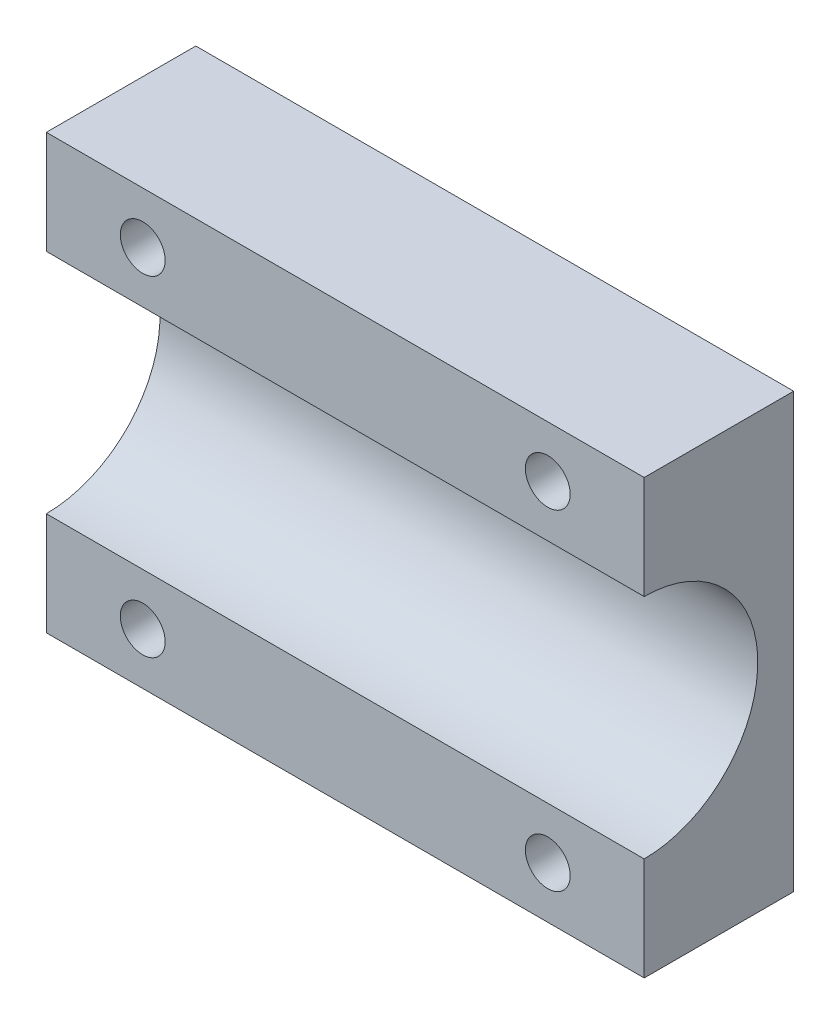
ISO-10303-21;
HEADER;
FILE_DESCRIPTION(('STEP AP214'),'2;1');
FILE_NAME('part.step','',(''),(''),'','','');
FILE_SCHEMA(('AUTOMOTIVE_DESIGN { 1 0 10303 214 1 1 1 1 }'));
ENDSEC;
DATA;
#1=APPLICATION_CONTEXT('core data for automotive mechanical design processes');
#2=APPLICATION_PROTOCOL_DEFINITION('international standard','automotive_design',2000,#1);
#3=PRODUCT_CONTEXT('',#1,'mechanical');
#4=PRODUCT('Part','Part','',(#3));
#5=PRODUCT_RELATED_PRODUCT_CATEGORY('part','',(#4));
#6=PRODUCT_DEFINITION_FORMATION('','',#4);
#7=PRODUCT_DEFINITION_CONTEXT('part definition',#1,'design');
#8=PRODUCT_DEFINITION('design','',#6,#7);
#9=PRODUCT_DEFINITION_SHAPE('','',#8);
#10=(LENGTH_UNIT() NAMED_UNIT(*) SI_UNIT(.MILLI.,.METRE.));
#11=(NAMED_UNIT(*) PLANE_ANGLE_UNIT() SI_UNIT($,.RADIAN.));
#12=(NAMED_UNIT(*) SI_UNIT($,.STERADIAN.) SOLID_ANGLE_UNIT());
#13=UNCERTAINTY_MEASURE_WITH_UNIT(LENGTH_MEASURE(1.E-05),#10,'distance_accuracy_value','');
#14=(GEOMETRIC_REPRESENTATION_CONTEXT(3) GLOBAL_UNCERTAINTY_ASSIGNED_CONTEXT((#13)) GLOBAL_UNIT_ASSIGNED_CONTEXT((#10,
#11,#12)) REPRESENTATION_CONTEXT('',''));
#15=CARTESIAN_POINT('',(0.,0.,0.));
#16=DIRECTION('',(0.,0.,1.));
#17=DIRECTION('',(1.,0.,0.));
#18=AXIS2_PLACEMENT_3D('',#15,#16,#17);
#19=CARTESIAN_POINT('',(0.,0.,10.));
#20=DIRECTION('',(0.,0.,1.));
#21=DIRECTION('',(1.,0.,0.));
#22=AXIS2_PLACEMENT_3D('',#19,#20,#21);
#23=PLANE('',#22);
#24=CARTESIAN_POINT('',(33.55,3.45000000000001,10.));
#25=DIRECTION('',(0.,0.,1.));
#26=DIRECTION('',(1.,0.,0.));
#27=AXIS2_PLACEMENT_3D('',#24,#25,#26);
#28=CIRCLE('',#27,1.5);
#29=CARTESIAN_POINT('',(35.05,3.45000000000001,10.));
#30=VERTEX_POINT('',#29);
#31=EDGE_CURVE('E156',#30,#30,#28,.T.);
#32=ORIENTED_EDGE('',*,*,#31,.F.);
#33=EDGE_LOOP('',(#32));
#34=FACE_BOUND('',#33,.T.);
#35=CARTESIAN_POINT('',(6.45,3.45,10.));
#36=DIRECTION('',(0.,0.,1.));
#37=DIRECTION('',(1.,0.,0.));
#38=AXIS2_PLACEMENT_3D('',#35,#36,#37);
#39=CIRCLE('',#38,1.5);
#40=CARTESIAN_POINT('',(7.95,3.45,10.));
#41=VERTEX_POINT('',#40);
#42=EDGE_CURVE('E164',#41,#41,#39,.T.);
#43=ORIENTED_EDGE('',*,*,#42,.F.);
#44=EDGE_LOOP('',(#43));
#45=FACE_BOUND('',#44,.T.);
#46=DIRECTION('',(1.,0.,0.));
#47=VECTOR('',#46,1.);
#48=CARTESIAN_POINT('',(-21.496046148071,6.9,10.));
#49=LINE('',#48,#47);
#50=CARTESIAN_POINT('',(0.,6.9,10.));
#51=VERTEX_POINT('',#50);
#52=CARTESIAN_POINT('',(40.,6.9,10.));
#53=VERTEX_POINT('',#52);
#54=EDGE_CURVE('E11',#51,#53,#49,.T.);
#55=ORIENTED_EDGE('',*,*,#54,.F.);
#56=DIRECTION('',(0.,1.,0.));
#57=VECTOR('',#56,1.);
#58=CARTESIAN_POINT('',(0.,0.,10.));
#59=LINE('',#58,#57);
#60=CARTESIAN_POINT('',(0.,0.,10.));
#61=VERTEX_POINT('',#60);
#62=EDGE_CURVE('E146',#61,#51,#59,.T.);
#63=ORIENTED_EDGE('',*,*,#62,.F.);
#64=DIRECTION('',(1.,0.,0.));
#65=VECTOR('',#64,1.);
#66=CARTESIAN_POINT('',(0.,0.,10.));
#67=LINE('',#66,#65);
#68=CARTESIAN_POINT('',(40.,0.,10.));
#69=VERTEX_POINT('',#68);
#70=EDGE_CURVE('E122',#61,#69,#67,.T.);
#71=ORIENTED_EDGE('',*,*,#70,.T.);
#72=DIRECTION('',(0.,1.,0.));
#73=VECTOR('',#72,1.);
#74=CARTESIAN_POINT('',(40.,0.,10.));
#75=LINE('',#74,#73);
#76=EDGE_CURVE('E118',#69,#53,#75,.T.);
#77=ORIENTED_EDGE('',*,*,#76,.T.);
#78=EDGE_LOOP('',(#55,#63,#71,#77));
#79=FACE_BOUND('',#78,.T.);
#80=ADVANCED_FACE('F47',(#34,#45,#79),#23,.T.);
#81=CARTESIAN_POINT('',(0.,29.,10.));
#82=DIRECTION('',(0.,1.,0.));
#83=DIRECTION('',(-1.,0.,0.));
#84=AXIS2_PLACEMENT_3D('',#81,#82,#83);
#85=PLANE('',#84);
#86=DIRECTION('',(1.,0.,0.));
#87=VECTOR('',#86,1.);
#88=CARTESIAN_POINT('',(0.,29.,0.));
#89=LINE('',#88,#87);
#90=CARTESIAN_POINT('',(0.,29.,0.));
#91=VERTEX_POINT('',#90);
#92=CARTESIAN_POINT('',(40.,29.,0.));
#93=VERTEX_POINT('',#92);
#94=EDGE_CURVE('E130',#91,#93,#89,.T.);
#95=ORIENTED_EDGE('',*,*,#94,.F.);
#96=DIRECTION('',(0.,0.,-1.));
#97=VECTOR('',#96,1.);
#98=CARTESIAN_POINT('',(0.,29.,10.));
#99=LINE('',#98,#97);
#100=CARTESIAN_POINT('',(0.,29.,10.));
#101=VERTEX_POINT('',#100);
#102=EDGE_CURVE('E144',#101,#91,#99,.T.);
#103=ORIENTED_EDGE('',*,*,#102,.F.);
#104=DIRECTION('',(1.,0.,0.));
#105=VECTOR('',#104,1.);
#106=CARTESIAN_POINT('',(0.,29.,10.));
#107=LINE('',#106,#105);
#108=CARTESIAN_POINT('',(40.,29.,10.));
#109=VERTEX_POINT('',#108);
#110=EDGE_CURVE('E139',#101,#109,#107,.T.);
#111=ORIENTED_EDGE('',*,*,#110,.T.);
#112=DIRECTION('',(0.,0.,-1.));
#113=VECTOR('',#112,1.);
#114=CARTESIAN_POINT('',(40.,29.,10.));
#115=LINE('',#114,#113);
#116=EDGE_CURVE('E91',#109,#93,#115,.T.);
#117=ORIENTED_EDGE('',*,*,#116,.T.);
#118=EDGE_LOOP('',(#95,#103,#111,#117));
#119=FACE_BOUND('',#118,.T.);
#120=ADVANCED_FACE('F49',(#119),#85,.T.);
#121=CARTESIAN_POINT('',(0.,0.,10.));
#122=DIRECTION('',(-1.,0.,0.));
#123=DIRECTION('',(0.,0.,1.));
#124=AXIS2_PLACEMENT_3D('',#121,#122,#123);
#125=PLANE('',#124);
#126=CARTESIAN_POINT('',(0.,14.5,10.));
#127=DIRECTION('',(-1.,0.,0.));
#128=DIRECTION('',(0.,0.,1.));
#129=AXIS2_PLACEMENT_3D('',#126,#127,#128);
#130=CIRCLE('',#129,7.6);
#131=CARTESIAN_POINT('',(0.,22.1,10.));
#132=VERTEX_POINT('',#131);
#133=EDGE_CURVE('E109',#51,#132,#130,.F.);
#134=ORIENTED_EDGE('',*,*,#133,.T.);
#135=EDGE_CURVE('E98',#132,#101,#59,.T.);
#136=ORIENTED_EDGE('',*,*,#135,.T.);
#137=ORIENTED_EDGE('',*,*,#102,.T.);
#138=DIRECTION('',(0.,1.,0.));
#139=VECTOR('',#138,1.);
#140=CARTESIAN_POINT('',(0.,0.,0.));
#141=LINE('',#140,#139);
#142=CARTESIAN_POINT('',(0.,0.,0.));
#143=VERTEX_POINT('',#142);
#144=EDGE_CURVE('E133',#143,#91,#141,.T.);
#145=ORIENTED_EDGE('',*,*,#144,.F.);
#146=DIRECTION('',(0.,0.,-1.));
#147=VECTOR('',#146,1.);
#148=CARTESIAN_POINT('',(0.,0.,10.));
#149=LINE('',#148,#147);
#150=EDGE_CURVE('E142',#61,#143,#149,.T.);
#151=ORIENTED_EDGE('',*,*,#150,.F.);
#152=ORIENTED_EDGE('',*,*,#62,.T.);
#153=EDGE_LOOP('',(#134,#136,#137,#145,#151,#152));
#154=FACE_BOUND('',#153,.T.);
#155=ADVANCED_FACE('F145',(#154),#125,.T.);
#156=CARTESIAN_POINT('',(0.,0.,10.));
#157=DIRECTION('',(0.,1.,0.));
#158=DIRECTION('',(-1.,0.,0.));
#159=AXIS2_PLACEMENT_3D('',#156,#157,#158);
#160=PLANE('',#159);
#161=DIRECTION('',(1.,0.,0.));
#162=VECTOR('',#161,1.);
#163=CARTESIAN_POINT('',(0.,0.,0.));
#164=LINE('',#163,#162);
#165=CARTESIAN_POINT('',(40.,0.,0.));
#166=VERTEX_POINT('',#165);
#167=EDGE_CURVE('E136',#143,#166,#164,.T.);
#168=ORIENTED_EDGE('',*,*,#167,.T.);
#169=DIRECTION('',(0.,0.,-1.));
#170=VECTOR('',#169,1.);
#171=CARTESIAN_POINT('',(40.,0.,10.));
#172=LINE('',#171,#170);
#173=EDGE_CURVE('E125',#69,#166,#172,.T.);
#174=ORIENTED_EDGE('',*,*,#173,.F.);
#175=ORIENTED_EDGE('',*,*,#70,.F.);
#176=ORIENTED_EDGE('',*,*,#150,.T.);
#177=EDGE_LOOP('',(#168,#174,#175,#176));
#178=FACE_BOUND('',#177,.T.);
#179=ADVANCED_FACE('F189',(#178),#160,.F.);
#180=CARTESIAN_POINT('',(40.,0.,10.));
#181=DIRECTION('',(-1.,0.,0.));
#182=DIRECTION('',(0.,0.,1.));
#183=AXIS2_PLACEMENT_3D('',#180,#181,#182);
#184=PLANE('',#183);
#185=CARTESIAN_POINT('',(40.,22.1,10.));
#186=VERTEX_POINT('',#185);
#187=EDGE_CURVE('E69',#186,#109,#75,.T.);
#188=ORIENTED_EDGE('',*,*,#187,.F.);
#189=CARTESIAN_POINT('',(40.,14.5,10.));
#190=DIRECTION('',(1.,0.,0.));
#191=DIRECTION('',(0.,0.,-1.));
#192=AXIS2_PLACEMENT_3D('',#189,#190,#191);
#193=CIRCLE('',#192,7.6);
#194=EDGE_CURVE('E61',#53,#186,#193,.T.);
#195=ORIENTED_EDGE('',*,*,#194,.F.);
#196=ORIENTED_EDGE('',*,*,#76,.F.);
#197=ORIENTED_EDGE('',*,*,#173,.T.);
#198=DIRECTION('',(0.,1.,0.));
#199=VECTOR('',#198,1.);
#200=CARTESIAN_POINT('',(40.,0.,0.));
#201=LINE('',#200,#199);
#202=EDGE_CURVE('E138',#166,#93,#201,.T.);
#203=ORIENTED_EDGE('',*,*,#202,.T.);
#204=ORIENTED_EDGE('',*,*,#116,.F.);
#205=EDGE_LOOP('',(#188,#195,#196,#197,#203,#204));
#206=FACE_BOUND('',#205,.T.);
#207=ADVANCED_FACE('F116',(#206),#184,.F.);
#208=CARTESIAN_POINT('',(6.45,25.55,10.));
#209=DIRECTION('',(0.,0.,1.));
#210=DIRECTION('',(1.,0.,0.));
#211=AXIS2_PLACEMENT_3D('',#208,#209,#210);
#212=CIRCLE('',#211,1.5);
#213=CARTESIAN_POINT('',(7.95,25.55,10.));
#214=VERTEX_POINT('',#213);
#215=EDGE_CURVE('E157',#214,#214,#212,.T.);
#216=ORIENTED_EDGE('',*,*,#215,.F.);
#217=EDGE_LOOP('',(#216));
#218=FACE_BOUND('',#217,.T.);
#219=CARTESIAN_POINT('',(33.55,25.55,10.));
#220=DIRECTION('',(0.,0.,1.));
#221=DIRECTION('',(1.,0.,0.));
#222=AXIS2_PLACEMENT_3D('',#219,#220,#221);
#223=CIRCLE('',#222,1.5);
#224=CARTESIAN_POINT('',(35.05,25.55,10.));
#225=VERTEX_POINT('',#224);
#226=EDGE_CURVE('E153',#225,#225,#223,.T.);
#227=ORIENTED_EDGE('',*,*,#226,.F.);
#228=EDGE_LOOP('',(#227));
#229=FACE_BOUND('',#228,.T.);
#230=DIRECTION('',(1.,0.,0.));
#231=VECTOR('',#230,1.);
#232=CARTESIAN_POINT('',(-21.496046148071,22.1,10.));
#233=LINE('',#232,#231);
#234=EDGE_CURVE('E55',#186,#132,#233,.F.);
#235=ORIENTED_EDGE('',*,*,#234,.F.);
#236=ORIENTED_EDGE('',*,*,#187,.T.);
#237=ORIENTED_EDGE('',*,*,#110,.F.);
#238=ORIENTED_EDGE('',*,*,#135,.F.);
#239=EDGE_LOOP('',(#235,#236,#237,#238));
#240=FACE_BOUND('',#239,.T.);
#241=ADVANCED_FACE('F148',(#218,#229,#240),#23,.T.);
#242=CARTESIAN_POINT('',(0.,0.,0.));
#243=DIRECTION('',(0.,0.,1.));
#244=DIRECTION('',(1.,0.,0.));
#245=AXIS2_PLACEMENT_3D('',#242,#243,#244);
#246=PLANE('',#245);
#247=CARTESIAN_POINT('',(33.55,3.45000000000001,0.));
#248=DIRECTION('',(0.,0.,1.));
#249=DIRECTION('',(1.,0.,0.));
#250=AXIS2_PLACEMENT_3D('',#247,#248,#249);
#251=CIRCLE('',#250,1.5);
#252=CARTESIAN_POINT('',(35.05,3.45000000000001,0.));
#253=VERTEX_POINT('',#252);
#254=EDGE_CURVE('E160',#253,#253,#251,.F.);
#255=ORIENTED_EDGE('',*,*,#254,.F.);
#256=EDGE_LOOP('',(#255));
#257=FACE_BOUND('',#256,.T.);
#258=CARTESIAN_POINT('',(6.45,25.55,0.));
#259=DIRECTION('',(0.,0.,1.));
#260=DIRECTION('',(1.,0.,0.));
#261=AXIS2_PLACEMENT_3D('',#258,#259,#260);
#262=CIRCLE('',#261,1.5);
#263=CARTESIAN_POINT('',(7.95,25.55,0.));
#264=VERTEX_POINT('',#263);
#265=EDGE_CURVE('E161',#264,#264,#262,.F.);
#266=ORIENTED_EDGE('',*,*,#265,.F.);
#267=EDGE_LOOP('',(#266));
#268=FACE_BOUND('',#267,.T.);
#269=CARTESIAN_POINT('',(6.45,3.45,0.));
#270=DIRECTION('',(0.,0.,1.));
#271=DIRECTION('',(1.,0.,0.));
#272=AXIS2_PLACEMENT_3D('',#269,#270,#271);
#273=CIRCLE('',#272,1.5);
#274=CARTESIAN_POINT('',(7.95,3.45,0.));
#275=VERTEX_POINT('',#274);
#276=EDGE_CURVE('E171',#275,#275,#273,.F.);
#277=ORIENTED_EDGE('',*,*,#276,.F.);
#278=EDGE_LOOP('',(#277));
#279=FACE_BOUND('',#278,.T.);
#280=CARTESIAN_POINT('',(33.55,25.55,0.));
#281=DIRECTION('',(0.,0.,1.));
#282=DIRECTION('',(1.,0.,0.));
#283=AXIS2_PLACEMENT_3D('',#280,#281,#282);
#284=CIRCLE('',#283,1.5);
#285=CARTESIAN_POINT('',(35.05,25.55,0.));
#286=VERTEX_POINT('',#285);
#287=EDGE_CURVE('E119',#286,#286,#284,.F.);
#288=ORIENTED_EDGE('',*,*,#287,.F.);
#289=EDGE_LOOP('',(#288));
#290=FACE_BOUND('',#289,.T.);
#291=ORIENTED_EDGE('',*,*,#94,.T.);
#292=ORIENTED_EDGE('',*,*,#202,.F.);
#293=ORIENTED_EDGE('',*,*,#167,.F.);
#294=ORIENTED_EDGE('',*,*,#144,.T.);
#295=EDGE_LOOP('',(#291,#292,#293,#294));
#296=FACE_BOUND('',#295,.T.);
#297=ADVANCED_FACE('F178',(#257,#268,#279,#290,#296),#246,.F.);
#298=CARTESIAN_POINT('',(-21.496046148071,14.5,10.));
#299=DIRECTION('',(1.,0.,0.));
#300=DIRECTION('',(0.,0.,-1.));
#301=AXIS2_PLACEMENT_3D('',#298,#299,#300);
#302=CYLINDRICAL_SURFACE('',#301,7.6);
#303=ORIENTED_EDGE('',*,*,#54,.T.);
#304=ORIENTED_EDGE('',*,*,#194,.T.);
#305=ORIENTED_EDGE('',*,*,#234,.T.);
#306=ORIENTED_EDGE('',*,*,#133,.F.);
#307=EDGE_LOOP('',(#303,#304,#305,#306));
#308=FACE_BOUND('',#307,.T.);
#309=ADVANCED_FACE('F108',(#308),#302,.F.);
#310=CARTESIAN_POINT('',(33.55,25.55,-4.24264068711929));
#311=DIRECTION('',(0.,0.,1.));
#312=DIRECTION('',(1.,0.,0.));
#313=AXIS2_PLACEMENT_3D('',#310,#311,#312);
#314=CYLINDRICAL_SURFACE('',#313,1.5);
#315=ORIENTED_EDGE('',*,*,#287,.T.);
#316=EDGE_LOOP('',(#315));
#317=FACE_BOUND('',#316,.T.);
#318=ORIENTED_EDGE('',*,*,#226,.T.);
#319=EDGE_LOOP('',(#318));
#320=FACE_BOUND('',#319,.T.);
#321=ADVANCED_FACE('F215',(#317,#320),#314,.F.);
#322=CARTESIAN_POINT('',(6.45,3.45,-4.24264068711929));
#323=DIRECTION('',(0.,0.,1.));
#324=DIRECTION('',(1.,0.,0.));
#325=AXIS2_PLACEMENT_3D('',#322,#323,#324);
#326=CYLINDRICAL_SURFACE('',#325,1.5);
#327=ORIENTED_EDGE('',*,*,#276,.T.);
#328=EDGE_LOOP('',(#327));
#329=FACE_BOUND('',#328,.T.);
#330=ORIENTED_EDGE('',*,*,#42,.T.);
#331=EDGE_LOOP('',(#330));
#332=FACE_BOUND('',#331,.T.);
#333=ADVANCED_FACE('F175',(#329,#332),#326,.F.);
#334=CARTESIAN_POINT('',(6.45,25.55,-4.24264068711929));
#335=DIRECTION('',(0.,0.,1.));
#336=DIRECTION('',(1.,0.,0.));
#337=AXIS2_PLACEMENT_3D('',#334,#335,#336);
#338=CYLINDRICAL_SURFACE('',#337,1.5);
#339=ORIENTED_EDGE('',*,*,#265,.T.);
#340=EDGE_LOOP('',(#339));
#341=FACE_BOUND('',#340,.T.);
#342=ORIENTED_EDGE('',*,*,#215,.T.);
#343=EDGE_LOOP('',(#342));
#344=FACE_BOUND('',#343,.T.);
#345=ADVANCED_FACE('F222',(#341,#344),#338,.F.);
#346=CARTESIAN_POINT('',(33.55,3.45000000000001,-4.24264068711929));
#347=DIRECTION('',(0.,0.,1.));
#348=DIRECTION('',(1.,0.,0.));
#349=AXIS2_PLACEMENT_3D('',#346,#347,#348);
#350=CYLINDRICAL_SURFACE('',#349,1.5);
#351=ORIENTED_EDGE('',*,*,#254,.T.);
#352=EDGE_LOOP('',(#351));
#353=FACE_BOUND('',#352,.T.);
#354=ORIENTED_EDGE('',*,*,#31,.T.);
#355=EDGE_LOOP('',(#354));
#356=FACE_BOUND('',#355,.T.);
#357=ADVANCED_FACE('F227',(#353,#356),#350,.F.);
#358=CLOSED_SHELL('',(#80,#120,#155,#179,#207,#241,#297,#309,#321,#333,#345,#357));
#359=MANIFOLD_SOLID_BREP('B2',#358);
#360=ADVANCED_BREP_SHAPE_REPRESENTATION('',(#18,#359),#14);
#361=SHAPE_DEFINITION_REPRESENTATION(#9,#360);
ENDSEC;
END-ISO-10303-21;
